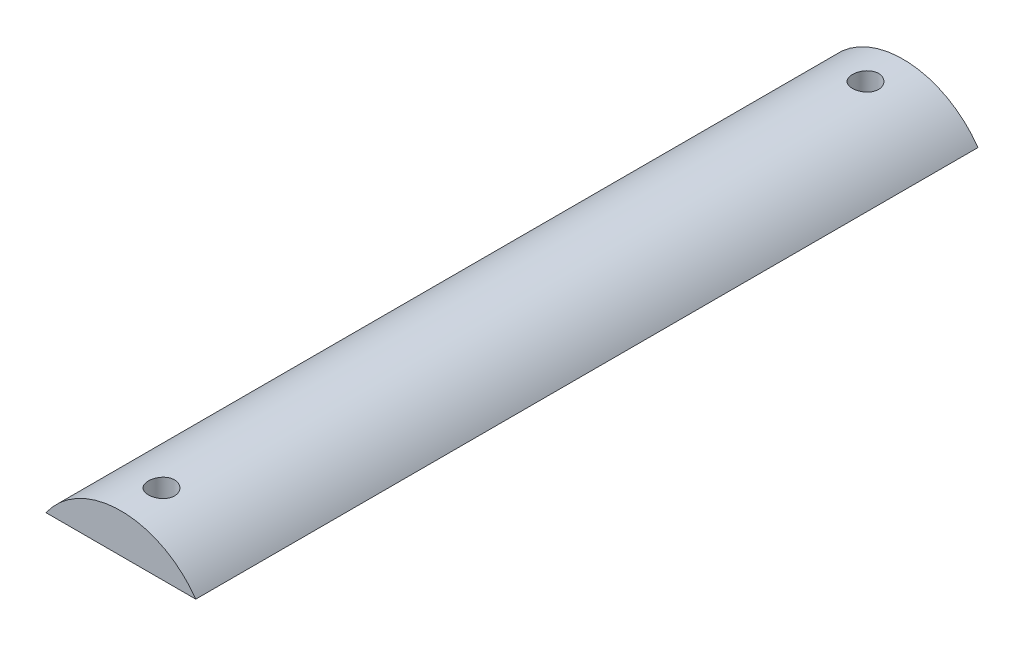
ISO-10303-21;
HEADER;
FILE_DESCRIPTION(('STEP AP214'),'2;1');
FILE_NAME('part.step','',(''),(''),'','','');
FILE_SCHEMA(('AUTOMOTIVE_DESIGN { 1 0 10303 214 1 1 1 1 }'));
ENDSEC;
DATA;
#1=APPLICATION_CONTEXT('core data for automotive mechanical design processes');
#2=APPLICATION_PROTOCOL_DEFINITION('international standard','automotive_design',2000,#1);
#3=PRODUCT_CONTEXT('',#1,'mechanical');
#4=PRODUCT('Part','Part','',(#3));
#5=PRODUCT_RELATED_PRODUCT_CATEGORY('part','',(#4));
#6=PRODUCT_DEFINITION_FORMATION('','',#4);
#7=PRODUCT_DEFINITION_CONTEXT('part definition',#1,'design');
#8=PRODUCT_DEFINITION('design','',#6,#7);
#9=PRODUCT_DEFINITION_SHAPE('','',#8);
#10=(LENGTH_UNIT() NAMED_UNIT(*) SI_UNIT(.MILLI.,.METRE.));
#11=(NAMED_UNIT(*) PLANE_ANGLE_UNIT() SI_UNIT($,.RADIAN.));
#12=(NAMED_UNIT(*) SI_UNIT($,.STERADIAN.) SOLID_ANGLE_UNIT());
#13=UNCERTAINTY_MEASURE_WITH_UNIT(LENGTH_MEASURE(1.E-05),#10,'distance_accuracy_value','');
#14=(GEOMETRIC_REPRESENTATION_CONTEXT(3) GLOBAL_UNCERTAINTY_ASSIGNED_CONTEXT((#13)) GLOBAL_UNIT_ASSIGNED_CONTEXT((#10,
#11,#12)) REPRESENTATION_CONTEXT('',''));
#15=CARTESIAN_POINT('',(0.,0.,0.));
#16=DIRECTION('',(0.,0.,1.));
#17=DIRECTION('',(1.,0.,0.));
#18=AXIS2_PLACEMENT_3D('',#15,#16,#17);
#19=CARTESIAN_POINT('',(0.,4.,60.));
#20=DIRECTION('',(0.,1.,0.));
#21=DIRECTION('',(0.,0.,1.));
#22=AXIS2_PLACEMENT_3D('',#19,#20,#21);
#23=PLANE('',#22);
#24=DIRECTION('',(-0.500000000000001,0.,-0.866025403784438));
#25=VECTOR('',#24,1.);
#26=CARTESIAN_POINT('',(-0.57748422060292,4.,60.3334106702179));
#27=LINE('',#26,#25);
#28=CARTESIAN_POINT('',(-1.34732922999352,4.,59.));
#29=VERTEX_POINT('',#28);
#30=CARTESIAN_POINT('',(-2.50202976837277,4.,57.));
#31=VERTEX_POINT('',#30);
#32=EDGE_CURVE('E238',#29,#31,#27,.T.);
#33=ORIENTED_EDGE('',*,*,#32,.F.);
#34=DIRECTION('',(-1.,0.,0.));
#35=VECTOR('',#34,1.);
#36=CARTESIAN_POINT('',(0.,4.,59.));
#37=LINE('',#36,#35);
#38=CARTESIAN_POINT('',(0.962071846764982,4.,59.));
#39=VERTEX_POINT('',#38);
#40=EDGE_CURVE('E228',#39,#29,#37,.T.);
#41=ORIENTED_EDGE('',*,*,#40,.F.);
#42=DIRECTION('',(-0.500000000000001,0.,0.866025403784438));
#43=VECTOR('',#42,1.);
#44=CARTESIAN_POINT('',(0.288541183181515,4.,60.1665893297821));
#45=LINE('',#44,#43);
#46=CARTESIAN_POINT('',(2.11677238514423,4.,57.));
#47=VERTEX_POINT('',#46);
#48=EDGE_CURVE('E230',#47,#39,#45,.T.);
#49=ORIENTED_EDGE('',*,*,#48,.F.);
#50=DIRECTION('',(0.5,0.,0.866025403784439));
#51=VECTOR('',#50,1.);
#52=CARTESIAN_POINT('',(2.88661739453483,4.,58.3334106702179));
#53=LINE('',#52,#51);
#54=CARTESIAN_POINT('',(0.962071846764983,4.,55.));
#55=VERTEX_POINT('',#54);
#56=EDGE_CURVE('E232',#55,#47,#53,.T.);
#57=ORIENTED_EDGE('',*,*,#56,.F.);
#58=DIRECTION('',(1.,0.,0.));
#59=VECTOR('',#58,1.);
#60=CARTESIAN_POINT('',(0.,4.,55.));
#61=LINE('',#60,#59);
#62=CARTESIAN_POINT('',(-1.34732922999352,4.,55.));
#63=VERTEX_POINT('',#62);
#64=EDGE_CURVE('E234',#63,#55,#61,.T.);
#65=ORIENTED_EDGE('',*,*,#64,.F.);
#66=DIRECTION('',(0.5,0.,-0.866025403784439));
#67=VECTOR('',#66,1.);
#68=CARTESIAN_POINT('',(-3.17556043195624,4.,58.1665893297821));
#69=LINE('',#68,#67);
#70=EDGE_CURVE('E236',#31,#63,#69,.T.);
#71=ORIENTED_EDGE('',*,*,#70,.F.);
#72=EDGE_LOOP('',(#33,#41,#49,#57,#65,#71));
#73=FACE_BOUND('',#72,.T.);
#74=DIRECTION('',(1.,0.,0.));
#75=VECTOR('',#74,1.);
#76=CARTESIAN_POINT('',(0.,4.,0.));
#77=LINE('',#76,#75);
#78=CARTESIAN_POINT('',(-5.74456264653803,4.,0.));
#79=VERTEX_POINT('',#78);
#80=CARTESIAN_POINT('',(5.74456264653803,4.,0.));
#81=VERTEX_POINT('',#80);
#82=EDGE_CURVE('E145',#79,#81,#77,.T.);
#83=ORIENTED_EDGE('',*,*,#82,.T.);
#84=DIRECTION('',(0.,0.,-1.));
#85=VECTOR('',#84,1.);
#86=CARTESIAN_POINT('',(5.74456264653803,4.,60.));
#87=LINE('',#86,#85);
#88=CARTESIAN_POINT('',(5.74456264653803,4.,60.));
#89=VERTEX_POINT('',#88);
#90=EDGE_CURVE('E225',#89,#81,#87,.T.);
#91=ORIENTED_EDGE('',*,*,#90,.F.);
#92=DIRECTION('',(1.,0.,0.));
#93=VECTOR('',#92,1.);
#94=CARTESIAN_POINT('',(0.,4.,60.));
#95=LINE('',#94,#93);
#96=CARTESIAN_POINT('',(-5.74456264653803,4.,60.));
#97=VERTEX_POINT('',#96);
#98=EDGE_CURVE('E213',#97,#89,#95,.T.);
#99=ORIENTED_EDGE('',*,*,#98,.F.);
#100=DIRECTION('',(0.,0.,-1.));
#101=VECTOR('',#100,1.);
#102=CARTESIAN_POINT('',(-5.74456264653803,4.,60.));
#103=LINE('',#102,#101);
#104=EDGE_CURVE('E219',#97,#79,#103,.T.);
#105=ORIENTED_EDGE('',*,*,#104,.T.);
#106=EDGE_LOOP('',(#83,#91,#99,#105));
#107=FACE_BOUND('',#106,.T.);
#108=DIRECTION('',(-0.5,0.,-0.866025403784439));
#109=VECTOR('',#108,1.);
#110=CARTESIAN_POINT('',(22.8052016815771,4.,46.8334106702178));
#111=LINE('',#110,#109);
#112=CARTESIAN_POINT('',(-1.34732922999333,4.,5.));
#113=VERTEX_POINT('',#112);
#114=CARTESIAN_POINT('',(-2.50202976837258,4.,3.));
#115=VERTEX_POINT('',#114);
#116=EDGE_CURVE('E11',#113,#115,#111,.T.);
#117=ORIENTED_EDGE('',*,*,#116,.F.);
#118=DIRECTION('',(-1.,0.,0.));
#119=VECTOR('',#118,1.);
#120=CARTESIAN_POINT('',(0.,4.,5.));
#121=LINE('',#120,#119);
#122=CARTESIAN_POINT('',(0.962071846765171,4.,5.));
#123=VERTEX_POINT('',#122);
#124=EDGE_CURVE('E240',#123,#113,#121,.T.);
#125=ORIENTED_EDGE('',*,*,#124,.F.);
#126=DIRECTION('',(-0.5,0.,0.866025403784439));
#127=VECTOR('',#126,1.);
#128=CARTESIAN_POINT('',(-23.0941447189982,4.,46.6665893297822));
#129=LINE('',#128,#127);
#130=CARTESIAN_POINT('',(2.11677238514442,4.,3.));
#131=VERTEX_POINT('',#130);
#132=EDGE_CURVE('E242',#131,#123,#129,.T.);
#133=ORIENTED_EDGE('',*,*,#132,.F.);
#134=DIRECTION('',(0.5,0.,0.866025403784439));
#135=VECTOR('',#134,1.);
#136=CARTESIAN_POINT('',(26.2693032967148,4.,44.8334106702178));
#137=LINE('',#136,#135);
#138=CARTESIAN_POINT('',(0.962071846765172,4.,1.));
#139=VERTEX_POINT('',#138);
#140=EDGE_CURVE('E244',#139,#131,#137,.T.);
#141=ORIENTED_EDGE('',*,*,#140,.F.);
#142=DIRECTION('',(1.,0.,0.));
#143=VECTOR('',#142,1.);
#144=CARTESIAN_POINT('',(0.,4.,1.));
#145=LINE('',#144,#143);
#146=CARTESIAN_POINT('',(-1.34732922999333,4.,0.999999999999999));
#147=VERTEX_POINT('',#146);
#148=EDGE_CURVE('E246',#147,#139,#145,.T.);
#149=ORIENTED_EDGE('',*,*,#148,.F.);
#150=DIRECTION('',(0.5,0.,-0.866025403784438));
#151=VECTOR('',#150,1.);
#152=CARTESIAN_POINT('',(-26.5582463341359,4.,44.6665893297822));
#153=LINE('',#152,#151);
#154=EDGE_CURVE('E42',#115,#147,#153,.T.);
#155=ORIENTED_EDGE('',*,*,#154,.F.);
#156=EDGE_LOOP('',(#117,#125,#133,#141,#149,#155));
#157=FACE_BOUND('',#156,.T.);
#158=ADVANCED_FACE('F34',(#73,#107,#157),#23,.F.);
#159=CARTESIAN_POINT('',(0.,0.,60.));
#160=DIRECTION('',(0.,0.,-1.));
#161=DIRECTION('',(-1.,0.,0.));
#162=AXIS2_PLACEMENT_3D('',#159,#160,#161);
#163=CYLINDRICAL_SURFACE('',#162,7.);
#164=CARTESIAN_POINT('',(0.,7.,1.88878577304297));
#165=CARTESIAN_POINT('',(0.0558653647064106,6.99999913522882,1.88878809963178));
#166=CARTESIAN_POINT('',(0.111763905495517,6.99932420200296,1.89348298020237));
#167=CARTESIAN_POINT('',(0.222000660368081,6.99669670505877,1.91213490927696));
#168=CARTESIAN_POINT('',(0.276337265533478,6.99474286996306,1.92610117481335));
#169=CARTESIAN_POINT('',(0.381838676785442,6.98977730161823,1.96287183477719));
#170=CARTESIAN_POINT('',(0.43300576934977,6.98676634168295,1.98566976986947));
#171=CARTESIAN_POINT('',(0.530779650240317,6.98001989080586,2.03944131593832));
#172=CARTESIAN_POINT('',(0.57738711543865,6.97628450765023,2.07041371089255));
#173=CARTESIAN_POINT('',(0.665058650397312,6.96847539120891,2.13988994421023));
#174=CARTESIAN_POINT('',(0.70608559080065,6.96439965767478,2.17844041590088));
#175=CARTESIAN_POINT('',(0.781111291768627,6.95638499821218,2.26187818758262));
#176=CARTESIAN_POINT('',(0.815109662708696,6.95244607987804,2.30676583863949));
#177=CARTESIAN_POINT('',(0.875255876422228,6.94513156490684,2.40185088909672));
#178=CARTESIAN_POINT('',(0.901368125473883,6.94175855199628,2.45207101932812));
#179=CARTESIAN_POINT('',(0.944773451668098,6.93598482656287,2.55624031253402));
#180=CARTESIAN_POINT('',(0.962066964544983,6.93358406600217,2.61018929111629));
#181=CARTESIAN_POINT('',(0.987229320061167,6.93004619376593,2.71989578287098));
#182=CARTESIAN_POINT('',(0.995161488527954,6.92890059523603,2.77563849297079));
#183=CARTESIAN_POINT('',(1.00157210007568,6.92797693845422,2.88767467847776));
#184=CARTESIAN_POINT('',(1.00005103626979,6.92819880887042,2.94396812500369));
#185=CARTESIAN_POINT('',(0.987650180979409,6.9299772577103,3.05506231837604));
#186=CARTESIAN_POINT('',(0.976840681796494,6.9315238110212,3.10987109508882));
#187=CARTESIAN_POINT('',(0.946279723214286,6.93576171689508,3.21688885932723));
#188=CARTESIAN_POINT('',(0.926528032474813,6.9384530990754,3.26909777955413));
#189=CARTESIAN_POINT('',(0.878569521249537,6.94468857735278,3.36964904615139));
#190=CARTESIAN_POINT('',(0.85033269311634,6.94823569081255,3.41797688542877));
#191=CARTESIAN_POINT('',(0.786226845720379,6.95578073890064,3.50923498523226));
#192=CARTESIAN_POINT('',(0.750357371512553,6.95977870039515,3.55216492377291));
#193=CARTESIAN_POINT('',(0.671617458714389,6.9678193568045,3.6318161761576));
#194=CARTESIAN_POINT('',(0.628686537577609,6.97186212884533,3.66847771810292));
#195=CARTESIAN_POINT('',(0.537249159400889,6.97950317895594,3.73408427426623));
#196=CARTESIAN_POINT('',(0.48874268187249,6.98310145539225,3.76302926012693));
#197=CARTESIAN_POINT('',(0.387481039813845,6.98945135313469,3.81238321054226));
#198=CARTESIAN_POINT('',(0.334723727733655,6.99220254306019,3.8327878277901));
#199=CARTESIAN_POINT('',(0.226483349377098,6.99654459946019,3.86443124236271));
#200=CARTESIAN_POINT('',(0.171000450315641,6.99813553702157,3.87567060123387));
#201=CARTESIAN_POINT('',(0.0594000111949732,6.99996847286368,3.88858558645318));
#202=CARTESIAN_POINT('',(0.003292169771196,7.00022206812239,3.89034343627721));
#203=CARTESIAN_POINT('',(-0.108417425156647,6.9993832363385,3.88446336903292));
#204=CARTESIAN_POINT('',(-0.164019192788028,6.99829084698658,3.87682571506042));
#205=CARTESIAN_POINT('',(-0.272891208992243,6.99488996866151,3.85243980224561));
#206=CARTESIAN_POINT('',(-0.326170552460061,6.99258679365044,3.83573134345319));
#207=CARTESIAN_POINT('',(-0.42917147201234,6.98702187136217,3.79371990339526));
#208=CARTESIAN_POINT('',(-0.47889289454054,6.98376008274315,3.7684165514534));
#209=CARTESIAN_POINT('',(-0.573729847898928,6.97661188585467,3.70973886454924));
#210=CARTESIAN_POINT('',(-0.618812606348984,6.97272147424604,3.67631205819024));
#211=CARTESIAN_POINT('',(-0.70275764740243,6.96476223215387,3.60240973501684));
#212=CARTESIAN_POINT('',(-0.74161960353929,6.96069339232073,3.56193384850063));
#213=CARTESIAN_POINT('',(-0.812316823103834,6.95279940084852,3.47471742256073));
#214=CARTESIAN_POINT('',(-0.844097150424188,6.94897630774254,3.4279321378927));
#215=CARTESIAN_POINT('',(-0.899347843769572,6.94204235740405,3.32963917974097));
#216=CARTESIAN_POINT('',(-0.922818417525415,6.9389314823679,3.27813162434716));
#217=CARTESIAN_POINT('',(-0.960697053792666,6.93378885130881,3.17202412078982));
#218=CARTESIAN_POINT('',(-0.975134650659851,6.93175358189617,3.11743489362231));
#219=CARTESIAN_POINT('',(-0.994631866000765,6.92898304632217,3.00657549251516));
#220=CARTESIAN_POINT('',(-0.999692066965096,6.92824769941436,2.95030542320412));
#221=CARTESIAN_POINT('',(-1.00027795187105,6.92816308872538,2.83822885978232));
#222=CARTESIAN_POINT('',(-0.99588998683903,6.92880127161589,2.78242280721531));
#223=CARTESIAN_POINT('',(-0.977888479253999,6.9313646210599,2.67235071101373));
#224=CARTESIAN_POINT('',(-0.964274946206753,6.93328978628734,2.61808466579245));
#225=CARTESIAN_POINT('',(-0.92823822782898,6.93820594738756,2.51265314048737));
#226=CARTESIAN_POINT('',(-0.905820514813007,6.94119628108845,2.46148575716145));
#227=CARTESIAN_POINT('',(-0.852820321015437,6.94790672863692,2.36362455056626));
#228=CARTESIAN_POINT('',(-0.822237615959198,6.95162686252979,2.31693085022727));
#229=CARTESIAN_POINT('',(-0.753459737315476,6.95941831326445,2.22890286377851));
#230=CARTESIAN_POINT('',(-0.715200464701825,6.96349241131826,2.18761890044185));
#231=CARTESIAN_POINT('',(-0.632290756660576,6.97150911027032,2.11202591932685));
#232=CARTESIAN_POINT('',(-0.587638832167471,6.97545168026666,2.07771853114872));
#233=CARTESIAN_POINT('',(-0.492951712266924,6.98278331246282,2.01690198702489));
#234=CARTESIAN_POINT('',(-0.442890858727149,6.98616952559765,1.99043244596402));
#235=CARTESIAN_POINT('',(-0.339010644185019,6.99197878037442,1.94631590103992));
#236=CARTESIAN_POINT('',(-0.285195302599491,6.99440283401541,1.92865962232677));
#237=CARTESIAN_POINT('',(-0.192605681998779,6.99745181502523,1.90674397958665));
#238=CARTESIAN_POINT('',(-0.154406949589287,6.99840255428231,1.90001975457384));
#239=CARTESIAN_POINT('',(-0.0774774606828319,6.99967694328895,1.89103986849886));
#240=CARTESIAN_POINT('',(-0.038746709911531,7.00000059978196,1.88878415938373));
#241=CARTESIAN_POINT('',(0.,7.,1.88878577304297));
#242=B_SPLINE_CURVE_WITH_KNOTS('',3,(#164,#165,#166,#167,#168,#169,#170,#171,#172,#173,#174,
#175,#176,#177,#178,#179,#180,#181,#182,#183,#184,#185,#186,#187,#188,#189,#190,#191,#192,#193,
#194,#195,#196,#197,#198,#199,#200,#201,#202,#203,#204,#205,#206,#207,#208,#209,#210,#211,#212,
#213,#214,#215,#216,#217,#218,#219,#220,#221,#222,#223,#224,#225,#226,#227,#228,#229,#230,#231,
#232,#233,#234,#235,#236,#237,#238,#239,#240,#241),.UNSPECIFIED.,.T.,.F.,(4,2,2,2,2,2,2,2,2,2,2,
2,2,2,2,2,2,2,2,2,2,2,2,2,2,2,2,2,2,2,2,2,2,2,2,2,2,2,4),(0.,0.167454526676438,
0.335075775995835,0.502574660696851,0.67004864250517,0.838587434288067,1.00713556641494,
1.17643344042558,1.34572294860658,1.51386059320977,1.68198946724779,1.84885708289861,
2.01572901576745,2.18319817810949,2.35067732527464,2.51967378353348,2.6886708628223,
2.85775386243831,3.02682650172624,3.19443056043042,3.3620299259403,3.5288997886847,
3.69577684902495,3.86376187993315,4.03175572377582,4.20101062362346,4.37026129206513,
4.53895564370425,4.70763951629676,4.87478825923561,5.0419368299494,5.20898167202542,
5.37603110293353,5.54453823754737,5.71308468724556,5.88246902499656,6.05167472923067,
6.1678179205788,6.28395986295406),.UNSPECIFIED.);
#243=CARTESIAN_POINT('',(0.,7.,1.88878577304297));
#244=VERTEX_POINT('',#243);
#245=EDGE_CURVE('E250',#244,#244,#242,.T.);
#246=ORIENTED_EDGE('',*,*,#245,.T.);
#247=EDGE_LOOP('',(#246));
#248=FACE_BOUND('',#247,.T.);
#249=CARTESIAN_POINT('',(-1.88539992297529E-13,7.,55.888785773043));
#250=CARTESIAN_POINT('',(0.0558653647062216,6.99999913522882,55.8887880996318));
#251=CARTESIAN_POINT('',(0.111763905495327,6.99932420200296,55.8934829802024));
#252=CARTESIAN_POINT('',(0.222000660367891,6.99669670505878,55.912134909277));
#253=CARTESIAN_POINT('',(0.276337265533289,6.99474286996307,55.9261011748133));
#254=CARTESIAN_POINT('',(0.381838676785251,6.98977730161824,55.9628718347772));
#255=CARTESIAN_POINT('',(0.433005769349578,6.98676634168296,55.9856697698695));
#256=CARTESIAN_POINT('',(0.530779650240125,6.98001989080588,56.0394413159383));
#257=CARTESIAN_POINT('',(0.577387115438459,6.97628450765025,56.0704137108925));
#258=CARTESIAN_POINT('',(0.665058650397123,6.96847539120893,56.1398899442102));
#259=CARTESIAN_POINT('',(0.706085590800462,6.96439965767479,56.1784404159009));
#260=CARTESIAN_POINT('',(0.781111291768438,6.95638499821219,56.2618781875826));
#261=CARTESIAN_POINT('',(0.815109662708507,6.95244607987806,56.3067658386395));
#262=CARTESIAN_POINT('',(0.875255876422038,6.94513156490687,56.4018508890967));
#263=CARTESIAN_POINT('',(0.901368125473694,6.94175855199631,56.4520710193281));
#264=CARTESIAN_POINT('',(0.944773451667908,6.9359848265629,56.556240312534));
#265=CARTESIAN_POINT('',(0.962066964544793,6.93358406600219,56.6101892911163));
#266=CARTESIAN_POINT('',(0.987229320060977,6.93004619376596,56.719895782871));
#267=CARTESIAN_POINT('',(0.995161488527763,6.92890059523605,56.7756384929708));
#268=CARTESIAN_POINT('',(1.00157210007549,6.92797693845424,56.8876746784778));
#269=CARTESIAN_POINT('',(1.0000510362696,6.92819880887044,56.9439681250037));
#270=CARTESIAN_POINT('',(0.98765018097922,6.92997725771032,57.055062318376));
#271=CARTESIAN_POINT('',(0.976840681796305,6.93152381102122,57.1098710950888));
#272=CARTESIAN_POINT('',(0.946279723214098,6.9357617168951,57.2168888593272));
#273=CARTESIAN_POINT('',(0.926528032474624,6.93845309907542,57.2690977795541));
#274=CARTESIAN_POINT('',(0.878569521249346,6.94468857735281,57.3696490461514));
#275=CARTESIAN_POINT('',(0.850332693116147,6.94823569081258,57.4179768854288));
#276=CARTESIAN_POINT('',(0.786226845720186,6.95578073890066,57.5092349852323));
#277=CARTESIAN_POINT('',(0.750357371512361,6.95977870039517,57.5521649237729));
#278=CARTESIAN_POINT('',(0.671617458714198,6.96781935680452,57.6318161761576));
#279=CARTESIAN_POINT('',(0.628686537577419,6.97186212884535,57.6684777181029));
#280=CARTESIAN_POINT('',(0.537249159400698,6.97950317895596,57.7340842742662));
#281=CARTESIAN_POINT('',(0.488742681872297,6.98310145539226,57.7630292601269));
#282=CARTESIAN_POINT('',(0.387481039813652,6.9894513531347,57.8123832105423));
#283=CARTESIAN_POINT('',(0.334723727733464,6.9922025430602,57.8327878277901));
#284=CARTESIAN_POINT('',(0.226483349376908,6.99654459946019,57.8644312423627));
#285=CARTESIAN_POINT('',(0.171000450315452,6.99813553702158,57.8756706012339));
#286=CARTESIAN_POINT('',(0.0594000111947845,6.99996847286368,57.8885855864532));
#287=CARTESIAN_POINT('',(0.00329216977100797,7.00022206812239,57.8903434362772));
#288=CARTESIAN_POINT('',(-0.108417425156834,6.9993832363385,57.8844633690329));
#289=CARTESIAN_POINT('',(-0.164019192788216,6.99829084698658,57.8768257150604));
#290=CARTESIAN_POINT('',(-0.27289120899243,6.9948899686615,57.8524398022456));
#291=CARTESIAN_POINT('',(-0.326170552460246,6.99258679365043,57.8357313434532));
#292=CARTESIAN_POINT('',(-0.429171472012526,6.98702187136215,57.7937199033953));
#293=CARTESIAN_POINT('',(-0.478892894540727,6.98376008274314,57.7684165514534));
#294=CARTESIAN_POINT('',(-0.573729847899117,6.97661188585466,57.7097388645492));
#295=CARTESIAN_POINT('',(-0.618812606349172,6.97272147424602,57.6763120581902));
#296=CARTESIAN_POINT('',(-0.702757647402617,6.96476223215385,57.6024097350168));
#297=CARTESIAN_POINT('',(-0.741619603539477,6.96069339232071,57.5619338485006));
#298=CARTESIAN_POINT('',(-0.812316823104022,6.9527994008485,57.4747174225607));
#299=CARTESIAN_POINT('',(-0.844097150424376,6.94897630774252,57.4279321378927));
#300=CARTESIAN_POINT('',(-0.89934784376976,6.94204235740403,57.329639179741));
#301=CARTESIAN_POINT('',(-0.922818417525602,6.93893148236787,57.2781316243472));
#302=CARTESIAN_POINT('',(-0.960697053792853,6.93378885130878,57.1720241207898));
#303=CARTESIAN_POINT('',(-0.975134650660039,6.93175358189615,57.1174348936223));
#304=CARTESIAN_POINT('',(-0.994631866000952,6.92898304632215,57.0065754925152));
#305=CARTESIAN_POINT('',(-0.999692066965282,6.92824769941433,56.9503054232041));
#306=CARTESIAN_POINT('',(-1.00027795187124,6.92816308872536,56.8382288597823));
#307=CARTESIAN_POINT('',(-0.995889986839217,6.92880127161586,56.7824228072153));
#308=CARTESIAN_POINT('',(-0.977888479254185,6.93136462105987,56.6723507110137));
#309=CARTESIAN_POINT('',(-0.96427494620694,6.93328978628731,56.6180846657925));
#310=CARTESIAN_POINT('',(-0.928238227829167,6.93820594738754,56.5126531404874));
#311=CARTESIAN_POINT('',(-0.905820514813196,6.94119628108842,56.4614857571614));
#312=CARTESIAN_POINT('',(-0.852820321015627,6.94790672863689,56.3636245505663));
#313=CARTESIAN_POINT('',(-0.822237615959386,6.95162686252977,56.3169308502273));
#314=CARTESIAN_POINT('',(-0.753459737315665,6.95941831326443,56.2289028637785));
#315=CARTESIAN_POINT('',(-0.715200464702015,6.96349241131824,56.1876189004419));
#316=CARTESIAN_POINT('',(-0.632290756660767,6.9715091102703,56.1120259193269));
#317=CARTESIAN_POINT('',(-0.58763883216766,6.97545168026664,56.0777185311487));
#318=CARTESIAN_POINT('',(-0.49295171226711,6.9827833124628,56.0169019870249));
#319=CARTESIAN_POINT('',(-0.442890858727335,6.98616952559764,55.990432445964));
#320=CARTESIAN_POINT('',(-0.339010644185206,6.99197878037441,55.9463159010399));
#321=CARTESIAN_POINT('',(-0.285195302599679,6.9944028340154,55.9286596223268));
#322=CARTESIAN_POINT('',(-0.192605681998968,6.99745181502523,55.9067439795867));
#323=CARTESIAN_POINT('',(-0.154406949589476,6.99840255428231,55.9000197545738));
#324=CARTESIAN_POINT('',(-0.0774774606830202,6.99967694328895,55.8910398684989));
#325=CARTESIAN_POINT('',(-0.0387467099117195,7.00000059978196,55.8887841593837));
#326=CARTESIAN_POINT('',(-1.88539992297529E-13,7.,55.888785773043));
#327=B_SPLINE_CURVE_WITH_KNOTS('',3,(#249,#250,#251,#252,#253,#254,#255,#256,#257,#258,#259,
#260,#261,#262,#263,#264,#265,#266,#267,#268,#269,#270,#271,#272,#273,#274,#275,#276,#277,#278,
#279,#280,#281,#282,#283,#284,#285,#286,#287,#288,#289,#290,#291,#292,#293,#294,#295,#296,#297,
#298,#299,#300,#301,#302,#303,#304,#305,#306,#307,#308,#309,#310,#311,#312,#313,#314,#315,#316,
#317,#318,#319,#320,#321,#322,#323,#324,#325,#326),.UNSPECIFIED.,.T.,.F.,(4,2,2,2,2,2,2,2,2,2,2,
2,2,2,2,2,2,2,2,2,2,2,2,2,2,2,2,2,2,2,2,2,2,2,2,2,2,2,4),(0.,0.167454526676438,
0.335075775995834,0.502574660696847,0.670048642505165,0.838587434288071,1.00713556641493,
1.17643344042558,1.34572294860658,1.51386059320977,1.68198946724778,1.8488570828986,
2.01572901576745,2.18319817810949,2.35067732527464,2.51967378353348,2.6886708628223,
2.8577538624383,3.02682650172623,3.19443056043042,3.36202992594029,3.52889978868469,
3.69577684902494,3.86376187993314,4.03175572377581,4.20101062362345,4.37026129206512,
4.53895564370424,4.70763951629674,4.87478825923559,5.04193682994939,5.2089816720254,
5.37603110293352,5.54453823754735,5.71308468724555,5.88246902499655,6.05167472923066,
6.16781792057879,6.28395986295405),.UNSPECIFIED.);
#328=CARTESIAN_POINT('',(-1.88539992297529E-13,7.,55.888785773043));
#329=VERTEX_POINT('',#328);
#330=EDGE_CURVE('E165',#329,#329,#327,.T.);
#331=ORIENTED_EDGE('',*,*,#330,.T.);
#332=EDGE_LOOP('',(#331));
#333=FACE_BOUND('',#332,.T.);
#334=CARTESIAN_POINT('',(0.,0.,0.));
#335=DIRECTION('',(0.,0.,1.));
#336=DIRECTION('',(1.,0.,0.));
#337=AXIS2_PLACEMENT_3D('',#334,#335,#336);
#338=CIRCLE('',#337,7.);
#339=EDGE_CURVE('E217',#81,#79,#338,.T.);
#340=ORIENTED_EDGE('',*,*,#339,.T.);
#341=ORIENTED_EDGE('',*,*,#104,.F.);
#342=CARTESIAN_POINT('',(0.,0.,60.));
#343=DIRECTION('',(0.,0.,1.));
#344=DIRECTION('',(1.,0.,0.));
#345=AXIS2_PLACEMENT_3D('',#342,#343,#344);
#346=CIRCLE('',#345,7.);
#347=EDGE_CURVE('E216',#89,#97,#346,.T.);
#348=ORIENTED_EDGE('',*,*,#347,.F.);
#349=ORIENTED_EDGE('',*,*,#90,.T.);
#350=EDGE_LOOP('',(#340,#341,#348,#349));
#351=FACE_BOUND('',#350,.T.);
#352=ADVANCED_FACE('F261',(#248,#333,#351),#163,.T.);
#353=CARTESIAN_POINT('',(0.,0.,60.));
#354=DIRECTION('',(0.,0.,1.));
#355=DIRECTION('',(1.,0.,0.));
#356=AXIS2_PLACEMENT_3D('',#353,#354,#355);
#357=PLANE('',#356);
#358=ORIENTED_EDGE('',*,*,#98,.T.);
#359=ORIENTED_EDGE('',*,*,#347,.T.);
#360=EDGE_LOOP('',(#358,#359));
#361=FACE_BOUND('',#360,.T.);
#362=ADVANCED_FACE('F322',(#361),#357,.T.);
#363=CARTESIAN_POINT('',(0.,0.,0.));
#364=DIRECTION('',(0.,0.,1.));
#365=DIRECTION('',(1.,0.,0.));
#366=AXIS2_PLACEMENT_3D('',#363,#364,#365);
#367=PLANE('',#366);
#368=ORIENTED_EDGE('',*,*,#82,.F.);
#369=ORIENTED_EDGE('',*,*,#339,.F.);
#370=EDGE_LOOP('',(#368,#369));
#371=FACE_BOUND('',#370,.T.);
#372=ADVANCED_FACE('F320',(#371),#367,.F.);
#373=CARTESIAN_POINT('',(-1.34732922999352,-5.,59.));
#374=DIRECTION('',(0.866025403784438,0.,-0.500000000000001));
#375=DIRECTION('',(-0.500000000000001,0.,-0.866025403784438));
#376=AXIS2_PLACEMENT_3D('',#373,#374,#375);
#377=PLANE('',#376);
#378=ORIENTED_EDGE('',*,*,#32,.T.);
#379=DIRECTION('',(0.,1.,0.));
#380=VECTOR('',#379,1.);
#381=CARTESIAN_POINT('',(-2.50202976837277,-5.,57.));
#382=LINE('',#381,#380);
#383=CARTESIAN_POINT('',(-2.50202976837277,5.,57.));
#384=VERTEX_POINT('',#383);
#385=EDGE_CURVE('E160',#31,#384,#382,.T.);
#386=ORIENTED_EDGE('',*,*,#385,.T.);
#387=DIRECTION('',(-0.500000000000001,0.,-0.866025403784438));
#388=VECTOR('',#387,1.);
#389=CARTESIAN_POINT('',(-1.34732922999352,5.,59.));
#390=LINE('',#389,#388);
#391=CARTESIAN_POINT('',(-1.34732922999352,5.,59.));
#392=VERTEX_POINT('',#391);
#393=EDGE_CURVE('E187',#392,#384,#390,.T.);
#394=ORIENTED_EDGE('',*,*,#393,.F.);
#395=DIRECTION('',(0.,1.,0.));
#396=VECTOR('',#395,1.);
#397=CARTESIAN_POINT('',(-1.34732922999352,-5.,59.));
#398=LINE('',#397,#396);
#399=EDGE_CURVE('E205',#29,#392,#398,.T.);
#400=ORIENTED_EDGE('',*,*,#399,.F.);
#401=EDGE_LOOP('',(#378,#386,#394,#400));
#402=FACE_BOUND('',#401,.T.);
#403=ADVANCED_FACE('F316',(#402),#377,.T.);
#404=CARTESIAN_POINT('',(-2.50202976837277,-5.,57.));
#405=DIRECTION('',(0.866025403784438,0.,0.5));
#406=DIRECTION('',(0.5,0.,-0.866025403784439));
#407=AXIS2_PLACEMENT_3D('',#404,#405,#406);
#408=PLANE('',#407);
#409=ORIENTED_EDGE('',*,*,#70,.T.);
#410=DIRECTION('',(0.,1.,0.));
#411=VECTOR('',#410,1.);
#412=CARTESIAN_POINT('',(-1.34732922999352,-5.,55.));
#413=LINE('',#412,#411);
#414=CARTESIAN_POINT('',(-1.34732922999352,5.,55.));
#415=VERTEX_POINT('',#414);
#416=EDGE_CURVE('E162',#63,#415,#413,.T.);
#417=ORIENTED_EDGE('',*,*,#416,.T.);
#418=DIRECTION('',(0.5,0.,-0.866025403784439));
#419=VECTOR('',#418,1.);
#420=CARTESIAN_POINT('',(-2.50202976837277,5.,57.));
#421=LINE('',#420,#419);
#422=EDGE_CURVE('E190',#384,#415,#421,.T.);
#423=ORIENTED_EDGE('',*,*,#422,.F.);
#424=ORIENTED_EDGE('',*,*,#385,.F.);
#425=EDGE_LOOP('',(#409,#417,#423,#424));
#426=FACE_BOUND('',#425,.T.);
#427=ADVANCED_FACE('F312',(#426),#408,.T.);
#428=CARTESIAN_POINT('',(-1.34732922999352,-5.,55.));
#429=DIRECTION('',(0.,0.,1.));
#430=DIRECTION('',(1.,0.,0.));
#431=AXIS2_PLACEMENT_3D('',#428,#429,#430);
#432=PLANE('',#431);
#433=ORIENTED_EDGE('',*,*,#64,.T.);
#434=DIRECTION('',(0.,1.,0.));
#435=VECTOR('',#434,1.);
#436=CARTESIAN_POINT('',(0.962071846764983,-5.,55.));
#437=LINE('',#436,#435);
#438=CARTESIAN_POINT('',(0.962071846764983,5.,55.));
#439=VERTEX_POINT('',#438);
#440=EDGE_CURVE('E210',#55,#439,#437,.T.);
#441=ORIENTED_EDGE('',*,*,#440,.T.);
#442=DIRECTION('',(1.,0.,0.));
#443=VECTOR('',#442,1.);
#444=CARTESIAN_POINT('',(-1.34732922999352,5.,55.));
#445=LINE('',#444,#443);
#446=EDGE_CURVE('E193',#415,#439,#445,.T.);
#447=ORIENTED_EDGE('',*,*,#446,.F.);
#448=ORIENTED_EDGE('',*,*,#416,.F.);
#449=EDGE_LOOP('',(#433,#441,#447,#448));
#450=FACE_BOUND('',#449,.T.);
#451=ADVANCED_FACE('F308',(#450),#432,.T.);
#452=CARTESIAN_POINT('',(0.962071846764983,-5.,55.));
#453=DIRECTION('',(-0.866025403784439,0.,0.5));
#454=DIRECTION('',(0.5,0.,0.866025403784439));
#455=AXIS2_PLACEMENT_3D('',#452,#453,#454);
#456=PLANE('',#455);
#457=ORIENTED_EDGE('',*,*,#56,.T.);
#458=DIRECTION('',(0.,1.,0.));
#459=VECTOR('',#458,1.);
#460=CARTESIAN_POINT('',(2.11677238514423,-5.,57.));
#461=LINE('',#460,#459);
#462=CARTESIAN_POINT('',(2.11677238514423,5.,57.));
#463=VERTEX_POINT('',#462);
#464=EDGE_CURVE('E208',#47,#463,#461,.T.);
#465=ORIENTED_EDGE('',*,*,#464,.T.);
#466=DIRECTION('',(0.5,0.,0.866025403784439));
#467=VECTOR('',#466,1.);
#468=CARTESIAN_POINT('',(0.962071846764983,5.,55.));
#469=LINE('',#468,#467);
#470=EDGE_CURVE('E196',#439,#463,#469,.T.);
#471=ORIENTED_EDGE('',*,*,#470,.F.);
#472=ORIENTED_EDGE('',*,*,#440,.F.);
#473=EDGE_LOOP('',(#457,#465,#471,#472));
#474=FACE_BOUND('',#473,.T.);
#475=ADVANCED_FACE('F304',(#474),#456,.T.);
#476=CARTESIAN_POINT('',(2.11677238514423,-5.,57.));
#477=DIRECTION('',(-0.866025403784438,0.,-0.500000000000001));
#478=DIRECTION('',(-0.500000000000001,0.,0.866025403784438));
#479=AXIS2_PLACEMENT_3D('',#476,#477,#478);
#480=PLANE('',#479);
#481=ORIENTED_EDGE('',*,*,#48,.T.);
#482=DIRECTION('',(0.,1.,0.));
#483=VECTOR('',#482,1.);
#484=CARTESIAN_POINT('',(0.962071846764982,-5.,59.));
#485=LINE('',#484,#483);
#486=CARTESIAN_POINT('',(0.962071846764982,5.,59.));
#487=VERTEX_POINT('',#486);
#488=EDGE_CURVE('E58',#39,#487,#485,.T.);
#489=ORIENTED_EDGE('',*,*,#488,.T.);
#490=DIRECTION('',(-0.500000000000001,0.,0.866025403784438));
#491=VECTOR('',#490,1.);
#492=CARTESIAN_POINT('',(2.11677238514423,5.,57.));
#493=LINE('',#492,#491);
#494=EDGE_CURVE('E199',#463,#487,#493,.T.);
#495=ORIENTED_EDGE('',*,*,#494,.F.);
#496=ORIENTED_EDGE('',*,*,#464,.F.);
#497=EDGE_LOOP('',(#481,#489,#495,#496));
#498=FACE_BOUND('',#497,.T.);
#499=ADVANCED_FACE('F301',(#498),#480,.T.);
#500=CARTESIAN_POINT('',(0.962071846764982,-5.,59.));
#501=DIRECTION('',(0.,0.,-1.));
#502=DIRECTION('',(-1.,0.,0.));
#503=AXIS2_PLACEMENT_3D('',#500,#501,#502);
#504=PLANE('',#503);
#505=ORIENTED_EDGE('',*,*,#40,.T.);
#506=ORIENTED_EDGE('',*,*,#399,.T.);
#507=DIRECTION('',(-1.,0.,0.));
#508=VECTOR('',#507,1.);
#509=CARTESIAN_POINT('',(0.962071846764982,5.,59.));
#510=LINE('',#509,#508);
#511=EDGE_CURVE('E202',#487,#392,#510,.T.);
#512=ORIENTED_EDGE('',*,*,#511,.F.);
#513=ORIENTED_EDGE('',*,*,#488,.F.);
#514=EDGE_LOOP('',(#505,#506,#512,#513));
#515=FACE_BOUND('',#514,.T.);
#516=ADVANCED_FACE('F297',(#515),#504,.T.);
#517=CARTESIAN_POINT('',(0.,5.,0.));
#518=DIRECTION('',(0.,-1.,0.));
#519=DIRECTION('',(0.,0.,-1.));
#520=AXIS2_PLACEMENT_3D('',#517,#518,#519);
#521=PLANE('',#520);
#522=CARTESIAN_POINT('',(-1.88539992297529E-13,5.,56.888785773043));
#523=DIRECTION('',(0.,-1.,0.));
#524=DIRECTION('',(0.,0.,-1.));
#525=AXIS2_PLACEMENT_3D('',#522,#523,#524);
#526=CIRCLE('',#525,0.999999999999998);
#527=CARTESIAN_POINT('',(-1.88539992297529E-13,5.,55.888785773043));
#528=VERTEX_POINT('',#527);
#529=EDGE_CURVE('E37',#528,#528,#526,.T.);
#530=ORIENTED_EDGE('',*,*,#529,.F.);
#531=EDGE_LOOP('',(#530));
#532=FACE_BOUND('',#531,.T.);
#533=ORIENTED_EDGE('',*,*,#393,.T.);
#534=ORIENTED_EDGE('',*,*,#422,.T.);
#535=ORIENTED_EDGE('',*,*,#446,.T.);
#536=ORIENTED_EDGE('',*,*,#470,.T.);
#537=ORIENTED_EDGE('',*,*,#494,.T.);
#538=ORIENTED_EDGE('',*,*,#511,.T.);
#539=EDGE_LOOP('',(#533,#534,#535,#536,#537,#538));
#540=FACE_BOUND('',#539,.T.);
#541=ADVANCED_FACE('F294',(#532,#540),#521,.T.);
#542=CARTESIAN_POINT('',(-1.34732922999333,-5.,5.));
#543=DIRECTION('',(0.866025403784439,0.,-0.5));
#544=DIRECTION('',(-0.5,0.,-0.866025403784439));
#545=AXIS2_PLACEMENT_3D('',#542,#543,#544);
#546=PLANE('',#545);
#547=ORIENTED_EDGE('',*,*,#116,.T.);
#548=DIRECTION('',(0.,1.,0.));
#549=VECTOR('',#548,1.);
#550=CARTESIAN_POINT('',(-2.50202976837258,-5.,3.));
#551=LINE('',#550,#549);
#552=CARTESIAN_POINT('',(-2.50202976837258,5.,3.));
#553=VERTEX_POINT('',#552);
#554=EDGE_CURVE('E135',#115,#553,#551,.T.);
#555=ORIENTED_EDGE('',*,*,#554,.T.);
#556=DIRECTION('',(-0.5,0.,-0.866025403784439));
#557=VECTOR('',#556,1.);
#558=CARTESIAN_POINT('',(-1.34732922999333,5.,5.));
#559=LINE('',#558,#557);
#560=CARTESIAN_POINT('',(-1.34732922999333,5.,5.));
#561=VERTEX_POINT('',#560);
#562=EDGE_CURVE('E140',#561,#553,#559,.T.);
#563=ORIENTED_EDGE('',*,*,#562,.F.);
#564=DIRECTION('',(0.,1.,0.));
#565=VECTOR('',#564,1.);
#566=CARTESIAN_POINT('',(-1.34732922999333,-5.,5.));
#567=LINE('',#566,#565);
#568=EDGE_CURVE('E179',#113,#561,#567,.T.);
#569=ORIENTED_EDGE('',*,*,#568,.F.);
#570=EDGE_LOOP('',(#547,#555,#563,#569));
#571=FACE_BOUND('',#570,.T.);
#572=ADVANCED_FACE('F137',(#571),#546,.T.);
#573=CARTESIAN_POINT('',(-2.50202976837258,-5.,3.));
#574=DIRECTION('',(0.866025403784438,0.,0.5));
#575=DIRECTION('',(0.5,0.,-0.866025403784438));
#576=AXIS2_PLACEMENT_3D('',#573,#574,#575);
#577=PLANE('',#576);
#578=ORIENTED_EDGE('',*,*,#154,.T.);
#579=DIRECTION('',(0.,1.,0.));
#580=VECTOR('',#579,1.);
#581=CARTESIAN_POINT('',(-1.34732922999333,-5.,0.999999999999999));
#582=LINE('',#581,#580);
#583=CARTESIAN_POINT('',(-1.34732922999333,5.,0.999999999999999));
#584=VERTEX_POINT('',#583);
#585=EDGE_CURVE('E146',#147,#584,#582,.T.);
#586=ORIENTED_EDGE('',*,*,#585,.T.);
#587=DIRECTION('',(0.5,0.,-0.866025403784438));
#588=VECTOR('',#587,1.);
#589=CARTESIAN_POINT('',(-2.50202976837258,5.,3.));
#590=LINE('',#589,#588);
#591=EDGE_CURVE('E149',#553,#584,#590,.T.);
#592=ORIENTED_EDGE('',*,*,#591,.F.);
#593=ORIENTED_EDGE('',*,*,#554,.F.);
#594=EDGE_LOOP('',(#578,#586,#592,#593));
#595=FACE_BOUND('',#594,.T.);
#596=ADVANCED_FACE('F150',(#595),#577,.T.);
#597=CARTESIAN_POINT('',(-1.34732922999333,-5.,0.999999999999999));
#598=DIRECTION('',(0.,0.,1.));
#599=DIRECTION('',(1.,0.,0.));
#600=AXIS2_PLACEMENT_3D('',#597,#598,#599);
#601=PLANE('',#600);
#602=ORIENTED_EDGE('',*,*,#148,.T.);
#603=DIRECTION('',(0.,1.,0.));
#604=VECTOR('',#603,1.);
#605=CARTESIAN_POINT('',(0.962071846765172,-5.,1.));
#606=LINE('',#605,#604);
#607=CARTESIAN_POINT('',(0.962071846765172,5.,1.));
#608=VERTEX_POINT('',#607);
#609=EDGE_CURVE('E184',#139,#608,#606,.T.);
#610=ORIENTED_EDGE('',*,*,#609,.T.);
#611=DIRECTION('',(1.,0.,0.));
#612=VECTOR('',#611,1.);
#613=CARTESIAN_POINT('',(-1.34732922999333,5.,0.999999999999999));
#614=LINE('',#613,#612);
#615=EDGE_CURVE('E155',#584,#608,#614,.T.);
#616=ORIENTED_EDGE('',*,*,#615,.F.);
#617=ORIENTED_EDGE('',*,*,#585,.F.);
#618=EDGE_LOOP('',(#602,#610,#616,#617));
#619=FACE_BOUND('',#618,.T.);
#620=ADVANCED_FACE('F285',(#619),#601,.T.);
#621=CARTESIAN_POINT('',(0.962071846765172,-5.,1.));
#622=DIRECTION('',(-0.866025403784439,0.,0.5));
#623=DIRECTION('',(0.5,0.,0.866025403784439));
#624=AXIS2_PLACEMENT_3D('',#621,#622,#623);
#625=PLANE('',#624);
#626=ORIENTED_EDGE('',*,*,#140,.T.);
#627=DIRECTION('',(0.,1.,0.));
#628=VECTOR('',#627,1.);
#629=CARTESIAN_POINT('',(2.11677238514442,-5.,3.));
#630=LINE('',#629,#628);
#631=CARTESIAN_POINT('',(2.11677238514442,5.,3.));
#632=VERTEX_POINT('',#631);
#633=EDGE_CURVE('E182',#131,#632,#630,.T.);
#634=ORIENTED_EDGE('',*,*,#633,.T.);
#635=DIRECTION('',(0.5,0.,0.866025403784439));
#636=VECTOR('',#635,1.);
#637=CARTESIAN_POINT('',(0.962071846765172,5.,1.));
#638=LINE('',#637,#636);
#639=EDGE_CURVE('E173',#608,#632,#638,.T.);
#640=ORIENTED_EDGE('',*,*,#639,.F.);
#641=ORIENTED_EDGE('',*,*,#609,.F.);
#642=EDGE_LOOP('',(#626,#634,#640,#641));
#643=FACE_BOUND('',#642,.T.);
#644=ADVANCED_FACE('F281',(#643),#625,.T.);
#645=CARTESIAN_POINT('',(2.11677238514442,-5.,3.));
#646=DIRECTION('',(-0.866025403784439,0.,-0.5));
#647=DIRECTION('',(-0.5,0.,0.866025403784439));
#648=AXIS2_PLACEMENT_3D('',#645,#646,#647);
#649=PLANE('',#648);
#650=ORIENTED_EDGE('',*,*,#132,.T.);
#651=DIRECTION('',(0.,1.,0.));
#652=VECTOR('',#651,1.);
#653=CARTESIAN_POINT('',(0.962071846765171,-5.,5.));
#654=LINE('',#653,#652);
#655=CARTESIAN_POINT('',(0.962071846765171,5.,5.));
#656=VERTEX_POINT('',#655);
#657=EDGE_CURVE('E50',#123,#656,#654,.T.);
#658=ORIENTED_EDGE('',*,*,#657,.T.);
#659=DIRECTION('',(-0.5,0.,0.866025403784438));
#660=VECTOR('',#659,1.);
#661=CARTESIAN_POINT('',(2.11677238514442,5.,3.));
#662=LINE('',#661,#660);
#663=EDGE_CURVE('E176',#632,#656,#662,.T.);
#664=ORIENTED_EDGE('',*,*,#663,.F.);
#665=ORIENTED_EDGE('',*,*,#633,.F.);
#666=EDGE_LOOP('',(#650,#658,#664,#665));
#667=FACE_BOUND('',#666,.T.);
#668=ADVANCED_FACE('F278',(#667),#649,.T.);
#669=CARTESIAN_POINT('',(0.962071846765171,-5.,5.));
#670=DIRECTION('',(0.,0.,-1.));
#671=DIRECTION('',(-1.,0.,0.));
#672=AXIS2_PLACEMENT_3D('',#669,#670,#671);
#673=PLANE('',#672);
#674=ORIENTED_EDGE('',*,*,#124,.T.);
#675=ORIENTED_EDGE('',*,*,#568,.T.);
#676=DIRECTION('',(-1.,0.,0.));
#677=VECTOR('',#676,1.);
#678=CARTESIAN_POINT('',(0.962071846765171,5.,5.));
#679=LINE('',#678,#677);
#680=EDGE_CURVE('E159',#656,#561,#679,.T.);
#681=ORIENTED_EDGE('',*,*,#680,.F.);
#682=ORIENTED_EDGE('',*,*,#657,.F.);
#683=EDGE_LOOP('',(#674,#675,#681,#682));
#684=FACE_BOUND('',#683,.T.);
#685=ADVANCED_FACE('F274',(#684),#673,.T.);
#686=CARTESIAN_POINT('',(0.,5.,0.));
#687=DIRECTION('',(0.,-1.,0.));
#688=DIRECTION('',(0.,0.,-1.));
#689=AXIS2_PLACEMENT_3D('',#686,#687,#688);
#690=PLANE('',#689);
#691=CARTESIAN_POINT('',(0.,5.,2.88878577304297));
#692=DIRECTION('',(0.,-1.,0.));
#693=DIRECTION('',(0.,0.,-1.));
#694=AXIS2_PLACEMENT_3D('',#691,#692,#693);
#695=CIRCLE('',#694,1.);
#696=CARTESIAN_POINT('',(0.,5.,1.88878577304297));
#697=VERTEX_POINT('',#696);
#698=EDGE_CURVE('E248',#697,#697,#695,.T.);
#699=ORIENTED_EDGE('',*,*,#698,.F.);
#700=EDGE_LOOP('',(#699));
#701=FACE_BOUND('',#700,.T.);
#702=ORIENTED_EDGE('',*,*,#562,.T.);
#703=ORIENTED_EDGE('',*,*,#591,.T.);
#704=ORIENTED_EDGE('',*,*,#615,.T.);
#705=ORIENTED_EDGE('',*,*,#639,.T.);
#706=ORIENTED_EDGE('',*,*,#663,.T.);
#707=ORIENTED_EDGE('',*,*,#680,.T.);
#708=EDGE_LOOP('',(#702,#703,#704,#705,#706,#707));
#709=FACE_BOUND('',#708,.T.);
#710=ADVANCED_FACE('F157',(#701,#709),#690,.T.);
#711=CARTESIAN_POINT('',(0.,7.,2.88878577304297));
#712=DIRECTION('',(0.,-1.,0.));
#713=DIRECTION('',(0.,0.,-1.));
#714=AXIS2_PLACEMENT_3D('',#711,#712,#713);
#715=CYLINDRICAL_SURFACE('',#714,1.);
#716=ORIENTED_EDGE('',*,*,#698,.T.);
#717=EDGE_LOOP('',(#716));
#718=FACE_BOUND('',#717,.T.);
#719=ORIENTED_EDGE('',*,*,#245,.F.);
#720=EDGE_LOOP('',(#719));
#721=FACE_BOUND('',#720,.T.);
#722=ADVANCED_FACE('F264',(#718,#721),#715,.F.);
#723=CARTESIAN_POINT('',(-1.88539992297529E-13,7.,56.888785773043));
#724=DIRECTION('',(0.,-1.,0.));
#725=DIRECTION('',(0.,0.,-1.));
#726=AXIS2_PLACEMENT_3D('',#723,#724,#725);
#727=CYLINDRICAL_SURFACE('',#726,0.999999999999998);
#728=ORIENTED_EDGE('',*,*,#529,.T.);
#729=EDGE_LOOP('',(#728));
#730=FACE_BOUND('',#729,.T.);
#731=ORIENTED_EDGE('',*,*,#330,.F.);
#732=EDGE_LOOP('',(#731));
#733=FACE_BOUND('',#732,.T.);
#734=ADVANCED_FACE('F267',(#730,#733),#727,.F.);
#735=CLOSED_SHELL('',(#158,#352,#362,#372,#403,#427,#451,#475,#499,#516,#541,#572,#596,#620,
#644,#668,#685,#710,#722,#734));
#736=MANIFOLD_SOLID_BREP('B2',#735);
#737=ADVANCED_BREP_SHAPE_REPRESENTATION('',(#18,#736),#14);
#738=SHAPE_DEFINITION_REPRESENTATION(#9,#737);
ENDSEC;
END-ISO-10303-21;
